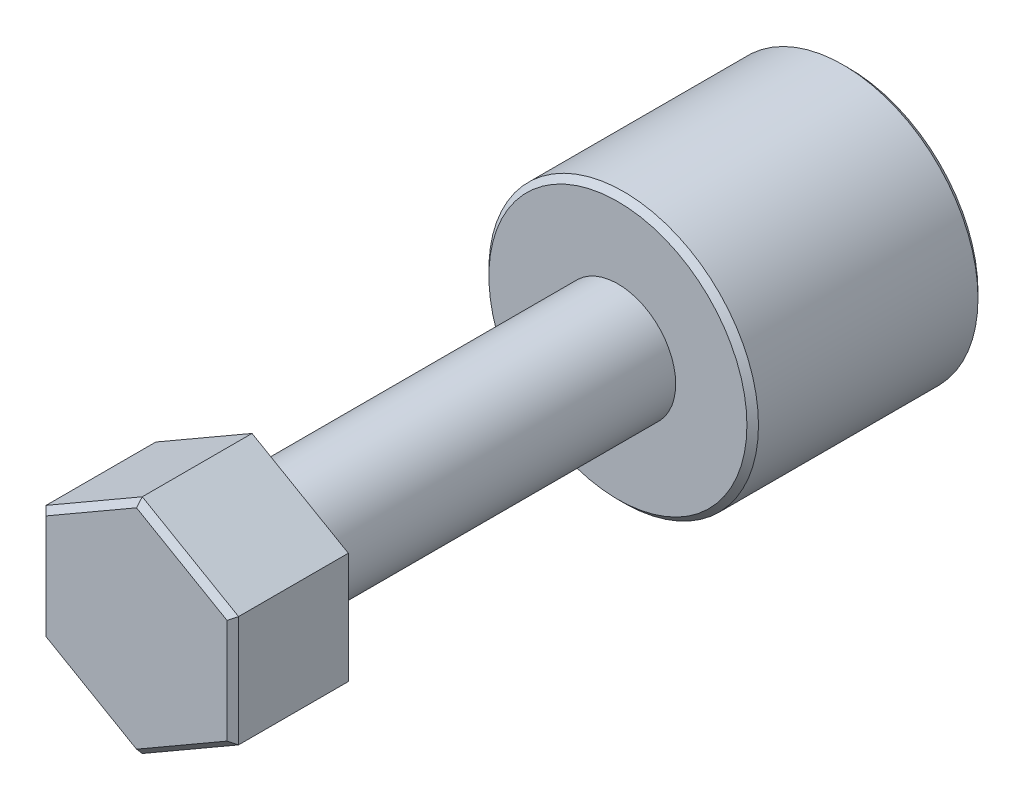
ISO-10303-21;
HEADER;
FILE_DESCRIPTION(('STEP AP214'),'2;1');
FILE_NAME('part.step','',(''),(''),'','','');
FILE_SCHEMA(('AUTOMOTIVE_DESIGN { 1 0 10303 214 1 1 1 1 }'));
ENDSEC;
DATA;
#1=APPLICATION_CONTEXT('core data for automotive mechanical design processes');
#2=APPLICATION_PROTOCOL_DEFINITION('international standard','automotive_design',2000,#1);
#3=PRODUCT_CONTEXT('',#1,'mechanical');
#4=PRODUCT('Part','Part','',(#3));
#5=PRODUCT_RELATED_PRODUCT_CATEGORY('part','',(#4));
#6=PRODUCT_DEFINITION_FORMATION('','',#4);
#7=PRODUCT_DEFINITION_CONTEXT('part definition',#1,'design');
#8=PRODUCT_DEFINITION('design','',#6,#7);
#9=PRODUCT_DEFINITION_SHAPE('','',#8);
#10=(LENGTH_UNIT() NAMED_UNIT(*) SI_UNIT(.MILLI.,.METRE.));
#11=(NAMED_UNIT(*) PLANE_ANGLE_UNIT() SI_UNIT($,.RADIAN.));
#12=(NAMED_UNIT(*) SI_UNIT($,.STERADIAN.) SOLID_ANGLE_UNIT());
#13=UNCERTAINTY_MEASURE_WITH_UNIT(LENGTH_MEASURE(1.E-05),#10,'distance_accuracy_value','');
#14=(GEOMETRIC_REPRESENTATION_CONTEXT(3) GLOBAL_UNCERTAINTY_ASSIGNED_CONTEXT((#13)) GLOBAL_UNIT_ASSIGNED_CONTEXT((#10,
#11,#12)) REPRESENTATION_CONTEXT('',''));
#15=CARTESIAN_POINT('',(0.,0.,0.));
#16=DIRECTION('',(0.,0.,1.));
#17=DIRECTION('',(1.,0.,0.));
#18=AXIS2_PLACEMENT_3D('',#15,#16,#17);
#19=CARTESIAN_POINT('',(0.,0.,37.));
#20=DIRECTION('',(0.,0.,-1.));
#21=DIRECTION('',(-1.,0.,0.));
#22=AXIS2_PLACEMENT_3D('',#19,#20,#21);
#23=CYLINDRICAL_SURFACE('',#22,3.);
#24=CARTESIAN_POINT('',(0.,0.,12.));
#25=DIRECTION('',(0.,0.,1.));
#26=DIRECTION('',(1.,0.,0.));
#27=AXIS2_PLACEMENT_3D('',#24,#25,#26);
#28=CIRCLE('',#27,3.);
#29=CARTESIAN_POINT('',(3.,0.,12.));
#30=VERTEX_POINT('',#29);
#31=EDGE_CURVE('E145',#30,#30,#28,.T.);
#32=ORIENTED_EDGE('',*,*,#31,.T.);
#33=EDGE_LOOP('',(#32));
#34=FACE_BOUND('',#33,.T.);
#35=CARTESIAN_POINT('',(0.,0.,31.));
#36=DIRECTION('',(0.,0.,1.));
#37=DIRECTION('',(1.,0.,0.));
#38=AXIS2_PLACEMENT_3D('',#35,#36,#37);
#39=CIRCLE('',#38,3.);
#40=CARTESIAN_POINT('',(3.,0.,31.));
#41=VERTEX_POINT('',#40);
#42=EDGE_CURVE('E157',#41,#41,#39,.T.);
#43=ORIENTED_EDGE('',*,*,#42,.F.);
#44=EDGE_LOOP('',(#43));
#45=FACE_BOUND('',#44,.T.);
#46=ADVANCED_FACE('F36',(#34,#45),#23,.T.);
#47=CARTESIAN_POINT('',(0.,0.,12.));
#48=DIRECTION('',(0.,0.,-1.));
#49=DIRECTION('',(-1.,0.,0.));
#50=AXIS2_PLACEMENT_3D('',#47,#48,#49);
#51=CYLINDRICAL_SURFACE('',#50,7.);
#52=CARTESIAN_POINT('',(0.,0.,0.300000000000002));
#53=DIRECTION('',(0.,0.,1.));
#54=DIRECTION('',(1.,0.,0.));
#55=AXIS2_PLACEMENT_3D('',#52,#53,#54);
#56=CIRCLE('',#55,7.);
#57=CARTESIAN_POINT('',(7.,0.,0.300000000000002));
#58=VERTEX_POINT('',#57);
#59=EDGE_CURVE('E187',#58,#58,#56,.T.);
#60=ORIENTED_EDGE('',*,*,#59,.T.);
#61=EDGE_LOOP('',(#60));
#62=FACE_BOUND('',#61,.T.);
#63=CARTESIAN_POINT('',(0.,0.,11.7));
#64=DIRECTION('',(0.,0.,1.));
#65=DIRECTION('',(1.,0.,0.));
#66=AXIS2_PLACEMENT_3D('',#63,#64,#65);
#67=CIRCLE('',#66,7.);
#68=CARTESIAN_POINT('',(7.,0.,11.7));
#69=VERTEX_POINT('',#68);
#70=EDGE_CURVE('E184',#69,#69,#67,.F.);
#71=ORIENTED_EDGE('',*,*,#70,.T.);
#72=EDGE_LOOP('',(#71));
#73=FACE_BOUND('',#72,.T.);
#74=ADVANCED_FACE('F247',(#62,#73),#51,.T.);
#75=CARTESIAN_POINT('',(0.,0.,12.));
#76=DIRECTION('',(0.,0.,1.));
#77=DIRECTION('',(1.,0.,0.));
#78=AXIS2_PLACEMENT_3D('',#75,#76,#77);
#79=PLANE('',#78);
#80=CARTESIAN_POINT('',(0.,0.,12.));
#81=DIRECTION('',(0.,0.,1.));
#82=DIRECTION('',(1.,0.,0.));
#83=AXIS2_PLACEMENT_3D('',#80,#81,#82);
#84=CIRCLE('',#83,6.7);
#85=CARTESIAN_POINT('',(6.7,0.,12.));
#86=VERTEX_POINT('',#85);
#87=EDGE_CURVE('E11',#86,#86,#84,.T.);
#88=ORIENTED_EDGE('',*,*,#87,.T.);
#89=EDGE_LOOP('',(#88));
#90=FACE_BOUND('',#89,.T.);
#91=ORIENTED_EDGE('',*,*,#31,.F.);
#92=EDGE_LOOP('',(#91));
#93=FACE_BOUND('',#92,.T.);
#94=ADVANCED_FACE('F253',(#90,#93),#79,.T.);
#95=CARTESIAN_POINT('',(0.,0.,0.));
#96=DIRECTION('',(0.,0.,1.));
#97=DIRECTION('',(1.,0.,0.));
#98=AXIS2_PLACEMENT_3D('',#95,#96,#97);
#99=PLANE('',#98);
#100=CARTESIAN_POINT('',(0.,0.,0.));
#101=DIRECTION('',(0.,0.,1.));
#102=DIRECTION('',(1.,0.,0.));
#103=AXIS2_PLACEMENT_3D('',#100,#101,#102);
#104=CIRCLE('',#103,6.7);
#105=CARTESIAN_POINT('',(6.7,0.,0.));
#106=VERTEX_POINT('',#105);
#107=EDGE_CURVE('E45',#106,#106,#104,.F.);
#108=ORIENTED_EDGE('',*,*,#107,.T.);
#109=EDGE_LOOP('',(#108));
#110=FACE_BOUND('',#109,.T.);
#111=ADVANCED_FACE('F262',(#110),#99,.F.);
#112=CARTESIAN_POINT('',(5.,-2.88675134594813,31.));
#113=DIRECTION('',(1.,0.,0.));
#114=DIRECTION('',(0.,1.,0.));
#115=AXIS2_PLACEMENT_3D('',#112,#113,#114);
#116=PLANE('',#115);
#117=DIRECTION('',(0.,0.,1.));
#118=VECTOR('',#117,1.);
#119=CARTESIAN_POINT('',(5.,2.88675134594813,31.));
#120=LINE('',#119,#118);
#121=CARTESIAN_POINT('',(5.,2.88675134594813,31.));
#122=VERTEX_POINT('',#121);
#123=CARTESIAN_POINT('',(5.,2.88675134594813,36.7));
#124=VERTEX_POINT('',#123);
#125=EDGE_CURVE('E108',#122,#124,#120,.T.);
#126=ORIENTED_EDGE('',*,*,#125,.T.);
#127=DIRECTION('',(0.,-1.,0.));
#128=VECTOR('',#127,1.);
#129=CARTESIAN_POINT('',(5.,-2.88675134594813,36.7));
#130=LINE('',#129,#128);
#131=CARTESIAN_POINT('',(5.,-2.88675134594813,36.7));
#132=VERTEX_POINT('',#131);
#133=EDGE_CURVE('E182',#124,#132,#130,.T.);
#134=ORIENTED_EDGE('',*,*,#133,.T.);
#135=DIRECTION('',(0.,0.,1.));
#136=VECTOR('',#135,1.);
#137=CARTESIAN_POINT('',(5.,-2.88675134594813,31.));
#138=LINE('',#137,#136);
#139=CARTESIAN_POINT('',(5.,-2.88675134594813,31.));
#140=VERTEX_POINT('',#139);
#141=EDGE_CURVE('E131',#140,#132,#138,.T.);
#142=ORIENTED_EDGE('',*,*,#141,.F.);
#143=DIRECTION('',(0.,1.,0.));
#144=VECTOR('',#143,1.);
#145=CARTESIAN_POINT('',(5.,-2.88675134594813,31.));
#146=LINE('',#145,#144);
#147=EDGE_CURVE('E123',#140,#122,#146,.T.);
#148=ORIENTED_EDGE('',*,*,#147,.T.);
#149=EDGE_LOOP('',(#126,#134,#142,#148));
#150=FACE_BOUND('',#149,.T.);
#151=ADVANCED_FACE('F129',(#150),#116,.T.);
#152=CARTESIAN_POINT('',(0.,-5.77350269189626,31.));
#153=DIRECTION('',(0.5,-0.866025403784439,0.));
#154=DIRECTION('',(0.866025403784439,0.5,0.));
#155=AXIS2_PLACEMENT_3D('',#152,#153,#154);
#156=PLANE('',#155);
#157=ORIENTED_EDGE('',*,*,#141,.T.);
#158=DIRECTION('',(-0.866025403784439,-0.5,0.));
#159=VECTOR('',#158,1.);
#160=CARTESIAN_POINT('',(0.,-5.77350269189626,36.7));
#161=LINE('',#160,#159);
#162=CARTESIAN_POINT('',(0.,-5.77350269189626,36.7));
#163=VERTEX_POINT('',#162);
#164=EDGE_CURVE('E173',#132,#163,#161,.T.);
#165=ORIENTED_EDGE('',*,*,#164,.T.);
#166=DIRECTION('',(0.,0.,1.));
#167=VECTOR('',#166,1.);
#168=CARTESIAN_POINT('',(0.,-5.77350269189626,31.));
#169=LINE('',#168,#167);
#170=CARTESIAN_POINT('',(0.,-5.77350269189626,31.));
#171=VERTEX_POINT('',#170);
#172=EDGE_CURVE('E146',#171,#163,#169,.T.);
#173=ORIENTED_EDGE('',*,*,#172,.F.);
#174=DIRECTION('',(0.866025403784439,0.5,0.));
#175=VECTOR('',#174,1.);
#176=CARTESIAN_POINT('',(0.,-5.77350269189626,31.));
#177=LINE('',#176,#175);
#178=EDGE_CURVE('E116',#171,#140,#177,.T.);
#179=ORIENTED_EDGE('',*,*,#178,.T.);
#180=EDGE_LOOP('',(#157,#165,#173,#179));
#181=FACE_BOUND('',#180,.T.);
#182=ADVANCED_FACE('F222',(#181),#156,.T.);
#183=CARTESIAN_POINT('',(-5.,-2.88675134594813,31.));
#184=DIRECTION('',(-0.5,-0.866025403784439,0.));
#185=DIRECTION('',(0.866025403784439,-0.5,0.));
#186=AXIS2_PLACEMENT_3D('',#183,#184,#185);
#187=PLANE('',#186);
#188=ORIENTED_EDGE('',*,*,#172,.T.);
#189=DIRECTION('',(-0.866025403784439,0.5,0.));
#190=VECTOR('',#189,1.);
#191=CARTESIAN_POINT('',(-5.,-2.88675134594813,36.7));
#192=LINE('',#191,#190);
#193=CARTESIAN_POINT('',(-5.,-2.88675134594813,36.7));
#194=VERTEX_POINT('',#193);
#195=EDGE_CURVE('E176',#163,#194,#192,.T.);
#196=ORIENTED_EDGE('',*,*,#195,.T.);
#197=DIRECTION('',(0.,0.,1.));
#198=VECTOR('',#197,1.);
#199=CARTESIAN_POINT('',(-5.,-2.88675134594813,31.));
#200=LINE('',#199,#198);
#201=CARTESIAN_POINT('',(-5.,-2.88675134594813,31.));
#202=VERTEX_POINT('',#201);
#203=EDGE_CURVE('E149',#202,#194,#200,.T.);
#204=ORIENTED_EDGE('',*,*,#203,.F.);
#205=DIRECTION('',(0.866025403784439,-0.5,0.));
#206=VECTOR('',#205,1.);
#207=CARTESIAN_POINT('',(-5.,-2.88675134594813,31.));
#208=LINE('',#207,#206);
#209=EDGE_CURVE('E140',#202,#171,#208,.T.);
#210=ORIENTED_EDGE('',*,*,#209,.T.);
#211=EDGE_LOOP('',(#188,#196,#204,#210));
#212=FACE_BOUND('',#211,.T.);
#213=ADVANCED_FACE('F231',(#212),#187,.T.);
#214=CARTESIAN_POINT('',(-5.,2.88675134594813,31.));
#215=DIRECTION('',(-1.,0.,0.));
#216=DIRECTION('',(0.,-1.,0.));
#217=AXIS2_PLACEMENT_3D('',#214,#215,#216);
#218=PLANE('',#217);
#219=ORIENTED_EDGE('',*,*,#203,.T.);
#220=DIRECTION('',(0.,1.,0.));
#221=VECTOR('',#220,1.);
#222=CARTESIAN_POINT('',(-5.,2.88675134594813,36.7));
#223=LINE('',#222,#221);
#224=CARTESIAN_POINT('',(-5.,2.88675134594813,36.7));
#225=VERTEX_POINT('',#224);
#226=EDGE_CURVE('E178',#194,#225,#223,.T.);
#227=ORIENTED_EDGE('',*,*,#226,.T.);
#228=DIRECTION('',(0.,0.,1.));
#229=VECTOR('',#228,1.);
#230=CARTESIAN_POINT('',(-5.,2.88675134594813,31.));
#231=LINE('',#230,#229);
#232=CARTESIAN_POINT('',(-5.,2.88675134594813,31.));
#233=VERTEX_POINT('',#232);
#234=EDGE_CURVE('E152',#233,#225,#231,.T.);
#235=ORIENTED_EDGE('',*,*,#234,.F.);
#236=DIRECTION('',(0.,-1.,0.));
#237=VECTOR('',#236,1.);
#238=CARTESIAN_POINT('',(-5.,2.88675134594813,31.));
#239=LINE('',#238,#237);
#240=EDGE_CURVE('E137',#233,#202,#239,.T.);
#241=ORIENTED_EDGE('',*,*,#240,.T.);
#242=EDGE_LOOP('',(#219,#227,#235,#241));
#243=FACE_BOUND('',#242,.T.);
#244=ADVANCED_FACE('F235',(#243),#218,.T.);
#245=CARTESIAN_POINT('',(0.,5.77350269189626,31.));
#246=DIRECTION('',(-0.5,0.866025403784438,0.));
#247=DIRECTION('',(-0.866025403784439,-0.5,0.));
#248=AXIS2_PLACEMENT_3D('',#245,#246,#247);
#249=PLANE('',#248);
#250=ORIENTED_EDGE('',*,*,#234,.T.);
#251=DIRECTION('',(0.866025403784439,0.5,0.));
#252=VECTOR('',#251,1.);
#253=CARTESIAN_POINT('',(0.,5.77350269189626,36.7));
#254=LINE('',#253,#252);
#255=CARTESIAN_POINT('',(0.,5.77350269189626,36.7));
#256=VERTEX_POINT('',#255);
#257=EDGE_CURVE('E61',#225,#256,#254,.T.);
#258=ORIENTED_EDGE('',*,*,#257,.T.);
#259=DIRECTION('',(0.,0.,1.));
#260=VECTOR('',#259,1.);
#261=CARTESIAN_POINT('',(0.,5.77350269189626,31.));
#262=LINE('',#261,#260);
#263=CARTESIAN_POINT('',(0.,5.77350269189626,31.));
#264=VERTEX_POINT('',#263);
#265=EDGE_CURVE('E115',#264,#256,#262,.T.);
#266=ORIENTED_EDGE('',*,*,#265,.F.);
#267=DIRECTION('',(-0.866025403784439,-0.5,0.));
#268=VECTOR('',#267,1.);
#269=CARTESIAN_POINT('',(0.,5.77350269189626,31.));
#270=LINE('',#269,#268);
#271=EDGE_CURVE('E127',#264,#233,#270,.T.);
#272=ORIENTED_EDGE('',*,*,#271,.T.);
#273=EDGE_LOOP('',(#250,#258,#266,#272));
#274=FACE_BOUND('',#273,.T.);
#275=ADVANCED_FACE('F348',(#274),#249,.T.);
#276=CARTESIAN_POINT('',(5.,2.88675134594813,31.));
#277=DIRECTION('',(0.5,0.866025403784439,0.));
#278=DIRECTION('',(-0.866025403784439,0.5,0.));
#279=AXIS2_PLACEMENT_3D('',#276,#277,#278);
#280=PLANE('',#279);
#281=ORIENTED_EDGE('',*,*,#265,.T.);
#282=DIRECTION('',(0.866025403784439,-0.5,0.));
#283=VECTOR('',#282,1.);
#284=CARTESIAN_POINT('',(5.,2.88675134594813,36.7));
#285=LINE('',#284,#283);
#286=EDGE_CURVE('E53',#256,#124,#285,.T.);
#287=ORIENTED_EDGE('',*,*,#286,.T.);
#288=ORIENTED_EDGE('',*,*,#125,.F.);
#289=DIRECTION('',(-0.866025403784439,0.5,0.));
#290=VECTOR('',#289,1.);
#291=CARTESIAN_POINT('',(5.,2.88675134594813,31.));
#292=LINE('',#291,#290);
#293=EDGE_CURVE('E111',#122,#264,#292,.T.);
#294=ORIENTED_EDGE('',*,*,#293,.T.);
#295=EDGE_LOOP('',(#281,#287,#288,#294));
#296=FACE_BOUND('',#295,.T.);
#297=ADVANCED_FACE('F110',(#296),#280,.T.);
#298=CARTESIAN_POINT('',(0.,0.,31.));
#299=DIRECTION('',(0.,0.,1.));
#300=DIRECTION('',(1.,0.,0.));
#301=AXIS2_PLACEMENT_3D('',#298,#299,#300);
#302=PLANE('',#301);
#303=ORIENTED_EDGE('',*,*,#42,.T.);
#304=EDGE_LOOP('',(#303));
#305=FACE_BOUND('',#304,.T.);
#306=ORIENTED_EDGE('',*,*,#147,.F.);
#307=ORIENTED_EDGE('',*,*,#178,.F.);
#308=ORIENTED_EDGE('',*,*,#209,.F.);
#309=ORIENTED_EDGE('',*,*,#240,.F.);
#310=ORIENTED_EDGE('',*,*,#271,.F.);
#311=ORIENTED_EDGE('',*,*,#293,.F.);
#312=EDGE_LOOP('',(#306,#307,#308,#309,#310,#311));
#313=FACE_BOUND('',#312,.T.);
#314=ADVANCED_FACE('F121',(#305,#313),#302,.F.);
#315=CARTESIAN_POINT('',(0.,0.,37.));
#316=DIRECTION('',(0.,0.,1.));
#317=DIRECTION('',(1.,0.,0.));
#318=AXIS2_PLACEMENT_3D('',#315,#316,#317);
#319=PLANE('',#318);
#320=DIRECTION('',(0.866025403784439,-0.5,0.));
#321=VECTOR('',#320,1.);
#322=CARTESIAN_POINT('',(-2.35,-4.07031939778686,37.));
#323=LINE('',#322,#321);
#324=CARTESIAN_POINT('',(-4.7,-2.71354626519124,37.));
#325=VERTEX_POINT('',#324);
#326=CARTESIAN_POINT('',(0.,-5.42709253038249,37.));
#327=VERTEX_POINT('',#326);
#328=EDGE_CURVE('E168',#325,#327,#323,.T.);
#329=ORIENTED_EDGE('',*,*,#328,.T.);
#330=DIRECTION('',(0.866025403784439,0.5,0.));
#331=VECTOR('',#330,1.);
#332=CARTESIAN_POINT('',(2.35,-4.07031939778686,37.));
#333=LINE('',#332,#331);
#334=CARTESIAN_POINT('',(4.7,-2.71354626519124,37.));
#335=VERTEX_POINT('',#334);
#336=EDGE_CURVE('E170',#327,#335,#333,.T.);
#337=ORIENTED_EDGE('',*,*,#336,.T.);
#338=DIRECTION('',(0.,1.,0.));
#339=VECTOR('',#338,1.);
#340=CARTESIAN_POINT('',(4.7,0.,37.));
#341=LINE('',#340,#339);
#342=CARTESIAN_POINT('',(4.7,2.71354626519124,37.));
#343=VERTEX_POINT('',#342);
#344=EDGE_CURVE('E160',#335,#343,#341,.T.);
#345=ORIENTED_EDGE('',*,*,#344,.T.);
#346=DIRECTION('',(-0.866025403784439,0.5,0.));
#347=VECTOR('',#346,1.);
#348=CARTESIAN_POINT('',(2.35,4.07031939778686,37.));
#349=LINE('',#348,#347);
#350=CARTESIAN_POINT('',(0.,5.42709253038248,37.));
#351=VERTEX_POINT('',#350);
#352=EDGE_CURVE('E162',#343,#351,#349,.T.);
#353=ORIENTED_EDGE('',*,*,#352,.T.);
#354=DIRECTION('',(-0.866025403784439,-0.5,0.));
#355=VECTOR('',#354,1.);
#356=CARTESIAN_POINT('',(-2.35,4.07031939778686,37.));
#357=LINE('',#356,#355);
#358=CARTESIAN_POINT('',(-4.7,2.71354626519124,37.));
#359=VERTEX_POINT('',#358);
#360=EDGE_CURVE('E164',#351,#359,#357,.T.);
#361=ORIENTED_EDGE('',*,*,#360,.T.);
#362=DIRECTION('',(0.,-1.,0.));
#363=VECTOR('',#362,1.);
#364=CARTESIAN_POINT('',(-4.7,0.,37.));
#365=LINE('',#364,#363);
#366=EDGE_CURVE('E166',#359,#325,#365,.T.);
#367=ORIENTED_EDGE('',*,*,#366,.T.);
#368=EDGE_LOOP('',(#329,#337,#345,#353,#361,#367));
#369=FACE_BOUND('',#368,.T.);
#370=ADVANCED_FACE('F212',(#369),#319,.T.);
#371=CARTESIAN_POINT('',(-2.35,4.07031939778686,37.));
#372=DIRECTION('',(0.353553390593272,-0.612372435695792,-0.707106781186551));
#373=DIRECTION('',(-0.866025403784439,-0.5,0.));
#374=AXIS2_PLACEMENT_3D('',#371,#372,#373);
#375=PLANE('',#374);
#376=DIRECTION('',(0.,-0.755928946018457,0.654653670707974));
#377=VECTOR('',#376,1.);
#378=CARTESIAN_POINT('',(0.,4.65179359747069,37.6714285714286));
#379=LINE('',#378,#377);
#380=EDGE_CURVE('E134',#256,#351,#379,.T.);
#381=ORIENTED_EDGE('',*,*,#380,.F.);
#382=ORIENTED_EDGE('',*,*,#257,.F.);
#383=DIRECTION('',(0.654653670707982,-0.377964473009227,0.654653670707973));
#384=VECTOR('',#383,1.);
#385=CARTESIAN_POINT('',(-4.02857142857142,2.32589679873535,37.6714285714286));
#386=LINE('',#385,#384);
#387=EDGE_CURVE('E40',#359,#225,#386,.F.);
#388=ORIENTED_EDGE('',*,*,#387,.F.);
#389=ORIENTED_EDGE('',*,*,#360,.F.);
#390=EDGE_LOOP('',(#381,#382,#388,#389));
#391=FACE_BOUND('',#390,.T.);
#392=ADVANCED_FACE('F208',(#391),#375,.F.);
#393=CARTESIAN_POINT('',(-4.7,0.,37.));
#394=DIRECTION('',(0.707106781186543,0.,-0.707106781186552));
#395=DIRECTION('',(0.,-1.,0.));
#396=AXIS2_PLACEMENT_3D('',#393,#394,#395);
#397=PLANE('',#396);
#398=ORIENTED_EDGE('',*,*,#387,.T.);
#399=ORIENTED_EDGE('',*,*,#226,.F.);
#400=DIRECTION('',(0.654653670707981,0.377964473009229,0.654653670707972));
#401=VECTOR('',#400,1.);
#402=CARTESIAN_POINT('',(-4.02857142857142,-2.32589679873535,37.6714285714286));
#403=LINE('',#402,#401);
#404=EDGE_CURVE('E199',#325,#194,#403,.F.);
#405=ORIENTED_EDGE('',*,*,#404,.F.);
#406=ORIENTED_EDGE('',*,*,#366,.F.);
#407=EDGE_LOOP('',(#398,#399,#405,#406));
#408=FACE_BOUND('',#407,.T.);
#409=ADVANCED_FACE('F237',(#408),#397,.F.);
#410=CARTESIAN_POINT('',(2.35,4.07031939778686,37.));
#411=DIRECTION('',(-0.353553390593272,-0.612372435695792,-0.70710678118655));
#412=DIRECTION('',(-0.866025403784439,0.5,0.));
#413=AXIS2_PLACEMENT_3D('',#410,#411,#412);
#414=PLANE('',#413);
#415=ORIENTED_EDGE('',*,*,#380,.T.);
#416=ORIENTED_EDGE('',*,*,#352,.F.);
#417=DIRECTION('',(-0.654653670707982,-0.377964473009226,0.654653670707973));
#418=VECTOR('',#417,1.);
#419=CARTESIAN_POINT('',(4.02857142857143,2.32589679873535,37.6714285714286));
#420=LINE('',#419,#418);
#421=EDGE_CURVE('E196',#124,#343,#420,.T.);
#422=ORIENTED_EDGE('',*,*,#421,.F.);
#423=ORIENTED_EDGE('',*,*,#286,.F.);
#424=EDGE_LOOP('',(#415,#416,#422,#423));
#425=FACE_BOUND('',#424,.T.);
#426=ADVANCED_FACE('F205',(#425),#414,.F.);
#427=CARTESIAN_POINT('',(-2.35,-4.07031939778686,37.));
#428=DIRECTION('',(0.353553390593272,0.612372435695791,-0.707106781186552));
#429=DIRECTION('',(0.866025403784439,-0.5,0.));
#430=AXIS2_PLACEMENT_3D('',#427,#428,#429);
#431=PLANE('',#430);
#432=ORIENTED_EDGE('',*,*,#404,.T.);
#433=ORIENTED_EDGE('',*,*,#195,.F.);
#434=DIRECTION('',(0.,0.755928946018459,0.654653670707973));
#435=VECTOR('',#434,1.);
#436=CARTESIAN_POINT('',(0.,-4.6517935974707,37.6714285714286));
#437=LINE('',#436,#435);
#438=EDGE_CURVE('E194',#327,#163,#437,.F.);
#439=ORIENTED_EDGE('',*,*,#438,.F.);
#440=ORIENTED_EDGE('',*,*,#328,.F.);
#441=EDGE_LOOP('',(#432,#433,#439,#440));
#442=FACE_BOUND('',#441,.T.);
#443=ADVANCED_FACE('F229',(#442),#431,.F.);
#444=CARTESIAN_POINT('',(4.7,0.,37.));
#445=DIRECTION('',(-0.707106781186543,0.,-0.707106781186552));
#446=DIRECTION('',(0.,1.,0.));
#447=AXIS2_PLACEMENT_3D('',#444,#445,#446);
#448=PLANE('',#447);
#449=ORIENTED_EDGE('',*,*,#421,.T.);
#450=ORIENTED_EDGE('',*,*,#344,.F.);
#451=DIRECTION('',(0.654653670707981,-0.377964473009228,-0.654653670707973));
#452=VECTOR('',#451,1.);
#453=CARTESIAN_POINT('',(4.02857142857142,-2.32589679873535,37.6714285714286));
#454=LINE('',#453,#452);
#455=EDGE_CURVE('E192',#132,#335,#454,.F.);
#456=ORIENTED_EDGE('',*,*,#455,.F.);
#457=ORIENTED_EDGE('',*,*,#133,.F.);
#458=EDGE_LOOP('',(#449,#450,#456,#457));
#459=FACE_BOUND('',#458,.T.);
#460=ADVANCED_FACE('F218',(#459),#448,.F.);
#461=CARTESIAN_POINT('',(2.35,-4.07031939778686,37.));
#462=DIRECTION('',(-0.353553390593272,0.612372435695791,-0.707106781186551));
#463=DIRECTION('',(0.866025403784439,0.5,0.));
#464=AXIS2_PLACEMENT_3D('',#461,#462,#463);
#465=PLANE('',#464);
#466=ORIENTED_EDGE('',*,*,#438,.T.);
#467=ORIENTED_EDGE('',*,*,#164,.F.);
#468=ORIENTED_EDGE('',*,*,#455,.T.);
#469=ORIENTED_EDGE('',*,*,#336,.F.);
#470=EDGE_LOOP('',(#466,#467,#468,#469));
#471=FACE_BOUND('',#470,.T.);
#472=ADVANCED_FACE('F224',(#471),#465,.F.);
#473=CARTESIAN_POINT('',(0.,0.,0.300000000000002));
#474=DIRECTION('',(0.,0.,1.));
#475=DIRECTION('',(1.,0.,0.));
#476=AXIS2_PLACEMENT_3D('',#473,#474,#475);
#477=CONICAL_SURFACE('',#476,7.,0.785398163397444);
#478=ORIENTED_EDGE('',*,*,#107,.F.);
#479=EDGE_LOOP('',(#478));
#480=FACE_BOUND('',#479,.T.);
#481=ORIENTED_EDGE('',*,*,#59,.F.);
#482=EDGE_LOOP('',(#481));
#483=FACE_BOUND('',#482,.T.);
#484=ADVANCED_FACE('F269',(#480,#483),#477,.T.);
#485=CARTESIAN_POINT('',(0.,0.,12.));
#486=DIRECTION('',(0.,0.,-1.));
#487=DIRECTION('',(-1.,0.,0.));
#488=AXIS2_PLACEMENT_3D('',#485,#486,#487);
#489=CONICAL_SURFACE('',#488,6.7,0.785398163397453);
#490=ORIENTED_EDGE('',*,*,#70,.F.);
#491=EDGE_LOOP('',(#490));
#492=FACE_BOUND('',#491,.T.);
#493=ORIENTED_EDGE('',*,*,#87,.F.);
#494=EDGE_LOOP('',(#493));
#495=FACE_BOUND('',#494,.T.);
#496=ADVANCED_FACE('F38',(#492,#495),#489,.T.);
#497=CLOSED_SHELL('',(#46,#74,#94,#111,#151,#182,#213,#244,#275,#297,#314,#370,#392,#409,#426,
#443,#460,#472,#484,#496));
#498=MANIFOLD_SOLID_BREP('B2',#497);
#499=ADVANCED_BREP_SHAPE_REPRESENTATION('',(#18,#498),#14);
#500=SHAPE_DEFINITION_REPRESENTATION(#9,#499);
ENDSEC;
END-ISO-10303-21;
